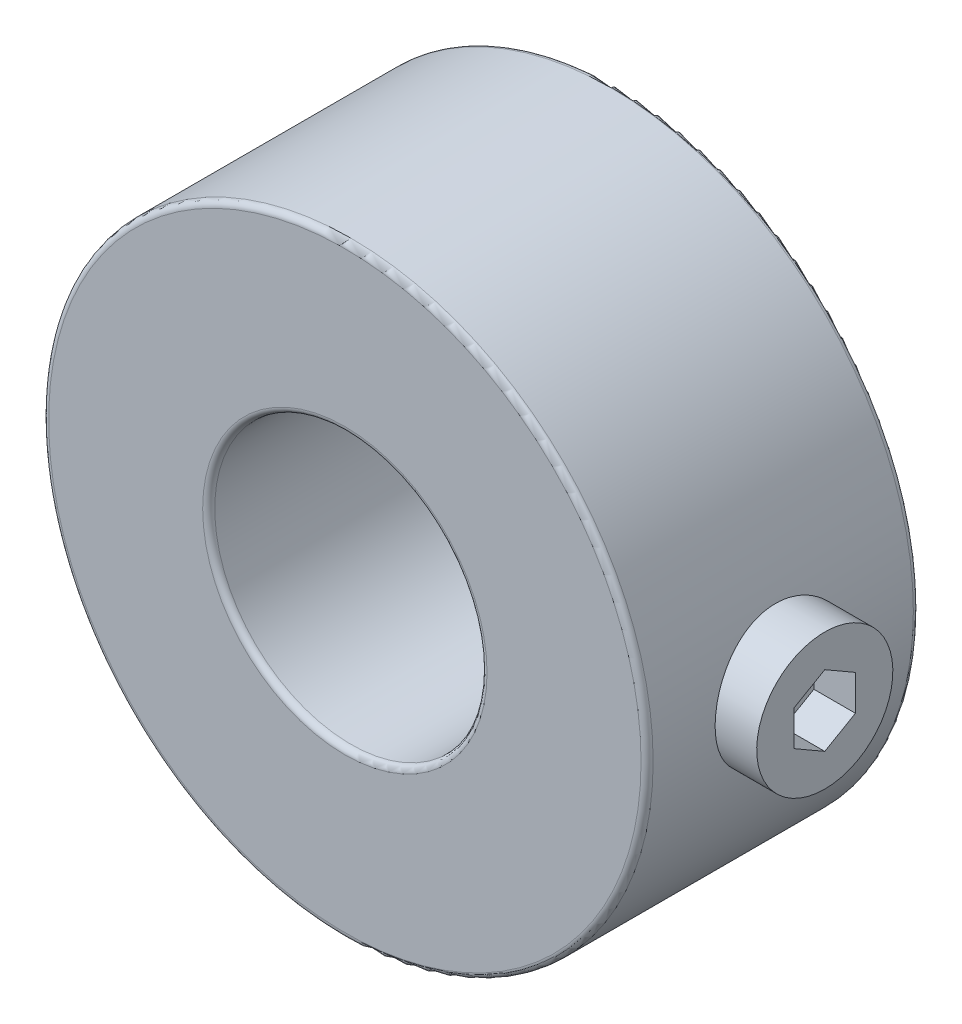
ISO-10303-21;
HEADER;
FILE_DESCRIPTION(('STEP AP214'),'2;1');
FILE_NAME('part.step','',(''),(''),'','','');
FILE_SCHEMA(('AUTOMOTIVE_DESIGN { 1 0 10303 214 1 1 1 1 }'));
ENDSEC;
DATA;
#1=APPLICATION_CONTEXT('core data for automotive mechanical design processes');
#2=APPLICATION_PROTOCOL_DEFINITION('international standard','automotive_design',2000,#1);
#3=PRODUCT_CONTEXT('',#1,'mechanical');
#4=PRODUCT('Part','Part','',(#3));
#5=PRODUCT_RELATED_PRODUCT_CATEGORY('part','',(#4));
#6=PRODUCT_DEFINITION_FORMATION('','',#4);
#7=PRODUCT_DEFINITION_CONTEXT('part definition',#1,'design');
#8=PRODUCT_DEFINITION('design','',#6,#7);
#9=PRODUCT_DEFINITION_SHAPE('','',#8);
#10=(LENGTH_UNIT() NAMED_UNIT(*) SI_UNIT(.MILLI.,.METRE.));
#11=(NAMED_UNIT(*) PLANE_ANGLE_UNIT() SI_UNIT($,.RADIAN.));
#12=(NAMED_UNIT(*) SI_UNIT($,.STERADIAN.) SOLID_ANGLE_UNIT());
#13=UNCERTAINTY_MEASURE_WITH_UNIT(LENGTH_MEASURE(1.E-05),#10,'distance_accuracy_value','');
#14=(GEOMETRIC_REPRESENTATION_CONTEXT(3) GLOBAL_UNCERTAINTY_ASSIGNED_CONTEXT((#13)) GLOBAL_UNIT_ASSIGNED_CONTEXT((#10,
#11,#12)) REPRESENTATION_CONTEXT('',''));
#15=CARTESIAN_POINT('',(0.,0.,0.));
#16=DIRECTION('',(0.,0.,1.));
#17=DIRECTION('',(1.,0.,0.));
#18=AXIS2_PLACEMENT_3D('',#15,#16,#17);
#19=CARTESIAN_POINT('',(6.525,0.,5.));
#20=DIRECTION('',(1.,0.,0.));
#21=DIRECTION('',(0.,1.,0.));
#22=AXIS2_PLACEMENT_3D('',#19,#20,#21);
#23=PLANE('',#22);
#24=CARTESIAN_POINT('',(6.525,0.,5.));
#25=DIRECTION('',(-1.,0.,0.));
#26=DIRECTION('',(0.,-1.,0.));
#27=AXIS2_PLACEMENT_3D('',#24,#25,#26);
#28=CIRCLE('',#27,2.5);
#29=CARTESIAN_POINT('',(6.525,-2.5,5.));
#30=VERTEX_POINT('',#29);
#31=EDGE_CURVE('E12',#30,#30,#28,.T.);
#32=ORIENTED_EDGE('',*,*,#31,.T.);
#33=EDGE_LOOP('',(#32));
#34=FACE_BOUND('',#33,.T.);
#35=ADVANCED_FACE('F44',(#34),#23,.F.);
#36=CARTESIAN_POINT('',(6.525,0.,5.));
#37=DIRECTION('',(-1.,0.,0.));
#38=DIRECTION('',(0.,-1.,0.));
#39=AXIS2_PLACEMENT_3D('',#36,#37,#38);
#40=CYLINDRICAL_SURFACE('',#39,2.5);
#41=ORIENTED_EDGE('',*,*,#31,.F.);
#42=EDGE_LOOP('',(#41));
#43=FACE_BOUND('',#42,.T.);
#44=CARTESIAN_POINT('',(12.625,0.,5.));
#45=DIRECTION('',(-1.,0.,0.));
#46=DIRECTION('',(0.,-1.,0.));
#47=AXIS2_PLACEMENT_3D('',#44,#45,#46);
#48=CIRCLE('',#47,2.5);
#49=CARTESIAN_POINT('',(12.625,-2.5,5.));
#50=VERTEX_POINT('',#49);
#51=EDGE_CURVE('E51',#50,#50,#48,.T.);
#52=ORIENTED_EDGE('',*,*,#51,.T.);
#53=EDGE_LOOP('',(#52));
#54=FACE_BOUND('',#53,.T.);
#55=ADVANCED_FACE('F154',(#43,#54),#40,.T.);
#56=CARTESIAN_POINT('',(12.625,0.,5.));
#57=DIRECTION('',(-1.,0.,0.));
#58=DIRECTION('',(0.,-1.,0.));
#59=AXIS2_PLACEMENT_3D('',#56,#57,#58);
#60=PLANE('',#59);
#61=DIRECTION('',(0.,-0.5,0.866025403784439));
#62=VECTOR('',#61,1.);
#63=CARTESIAN_POINT('',(12.625,1.29903810567666,5.));
#64=LINE('',#63,#62);
#65=CARTESIAN_POINT('',(12.625,1.29903810567666,5.));
#66=VERTEX_POINT('',#65);
#67=CARTESIAN_POINT('',(12.625,0.649519052838334,6.125));
#68=VERTEX_POINT('',#67);
#69=EDGE_CURVE('E112',#66,#68,#64,.T.);
#70=ORIENTED_EDGE('',*,*,#69,.F.);
#71=DIRECTION('',(0.,0.5,0.866025403784439));
#72=VECTOR('',#71,1.);
#73=CARTESIAN_POINT('',(12.625,0.649519052838332,3.875));
#74=LINE('',#73,#72);
#75=CARTESIAN_POINT('',(12.625,0.649519052838332,3.875));
#76=VERTEX_POINT('',#75);
#77=EDGE_CURVE('E58',#76,#66,#74,.T.);
#78=ORIENTED_EDGE('',*,*,#77,.F.);
#79=DIRECTION('',(0.,1.,0.));
#80=VECTOR('',#79,1.);
#81=CARTESIAN_POINT('',(12.625,-0.649519052838325,3.875));
#82=LINE('',#81,#80);
#83=CARTESIAN_POINT('',(12.625,-0.649519052838325,3.875));
#84=VERTEX_POINT('',#83);
#85=EDGE_CURVE('E128',#84,#76,#82,.T.);
#86=ORIENTED_EDGE('',*,*,#85,.F.);
#87=DIRECTION('',(0.,0.5,-0.866025403784439));
#88=VECTOR('',#87,1.);
#89=CARTESIAN_POINT('',(12.625,-1.29903810567665,5.));
#90=LINE('',#89,#88);
#91=CARTESIAN_POINT('',(12.625,-1.29903810567665,5.));
#92=VERTEX_POINT('',#91);
#93=EDGE_CURVE('E122',#92,#84,#90,.T.);
#94=ORIENTED_EDGE('',*,*,#93,.F.);
#95=DIRECTION('',(0.,-0.5,-0.866025403784438));
#96=VECTOR('',#95,1.);
#97=CARTESIAN_POINT('',(12.625,-0.649519052838323,6.125));
#98=LINE('',#97,#96);
#99=CARTESIAN_POINT('',(12.625,-0.649519052838323,6.125));
#100=VERTEX_POINT('',#99);
#101=EDGE_CURVE('E120',#100,#92,#98,.T.);
#102=ORIENTED_EDGE('',*,*,#101,.F.);
#103=DIRECTION('',(0.,-1.,0.));
#104=VECTOR('',#103,1.);
#105=CARTESIAN_POINT('',(12.625,0.649519052838334,6.125));
#106=LINE('',#105,#104);
#107=EDGE_CURVE('E101',#68,#100,#106,.T.);
#108=ORIENTED_EDGE('',*,*,#107,.F.);
#109=EDGE_LOOP('',(#70,#78,#86,#94,#102,#108));
#110=FACE_BOUND('',#109,.T.);
#111=ORIENTED_EDGE('',*,*,#51,.F.);
#112=EDGE_LOOP('',(#111));
#113=FACE_BOUND('',#112,.T.);
#114=ADVANCED_FACE('F116',(#110,#113),#60,.F.);
#115=CARTESIAN_POINT('',(11.1,0.649519052838332,3.875));
#116=DIRECTION('',(0.,0.866025403784439,-0.5));
#117=DIRECTION('',(0.,0.5,0.866025403784439));
#118=AXIS2_PLACEMENT_3D('',#115,#116,#117);
#119=PLANE('',#118);
#120=ORIENTED_EDGE('',*,*,#77,.T.);
#121=DIRECTION('',(1.,0.,0.));
#122=VECTOR('',#121,1.);
#123=CARTESIAN_POINT('',(11.1,1.29903810567666,5.));
#124=LINE('',#123,#122);
#125=CARTESIAN_POINT('',(11.1,1.29903810567666,5.));
#126=VERTEX_POINT('',#125);
#127=EDGE_CURVE('E109',#126,#66,#124,.T.);
#128=ORIENTED_EDGE('',*,*,#127,.F.);
#129=DIRECTION('',(0.,0.5,0.866025403784439));
#130=VECTOR('',#129,1.);
#131=CARTESIAN_POINT('',(11.1,0.649519052838332,3.875));
#132=LINE('',#131,#130);
#133=CARTESIAN_POINT('',(11.1,0.649519052838332,3.875));
#134=VERTEX_POINT('',#133);
#135=EDGE_CURVE('E130',#134,#126,#132,.T.);
#136=ORIENTED_EDGE('',*,*,#135,.F.);
#137=DIRECTION('',(1.,0.,0.));
#138=VECTOR('',#137,1.);
#139=CARTESIAN_POINT('',(11.1,0.649519052838332,3.875));
#140=LINE('',#139,#138);
#141=EDGE_CURVE('E65',#134,#76,#140,.T.);
#142=ORIENTED_EDGE('',*,*,#141,.T.);
#143=EDGE_LOOP('',(#120,#128,#136,#142));
#144=FACE_BOUND('',#143,.T.);
#145=ADVANCED_FACE('F156',(#144),#119,.F.);
#146=CARTESIAN_POINT('',(11.1,-0.649519052838325,3.875));
#147=DIRECTION('',(0.,0.,-1.));
#148=DIRECTION('',(-1.,0.,0.));
#149=AXIS2_PLACEMENT_3D('',#146,#147,#148);
#150=PLANE('',#149);
#151=ORIENTED_EDGE('',*,*,#85,.T.);
#152=ORIENTED_EDGE('',*,*,#141,.F.);
#153=DIRECTION('',(0.,1.,0.));
#154=VECTOR('',#153,1.);
#155=CARTESIAN_POINT('',(11.1,-0.649519052838325,3.875));
#156=LINE('',#155,#154);
#157=CARTESIAN_POINT('',(11.1,-0.649519052838325,3.875));
#158=VERTEX_POINT('',#157);
#159=EDGE_CURVE('E142',#158,#134,#156,.T.);
#160=ORIENTED_EDGE('',*,*,#159,.F.);
#161=DIRECTION('',(1.,0.,0.));
#162=VECTOR('',#161,1.);
#163=CARTESIAN_POINT('',(11.1,-0.649519052838325,3.875));
#164=LINE('',#163,#162);
#165=EDGE_CURVE('E146',#158,#84,#164,.T.);
#166=ORIENTED_EDGE('',*,*,#165,.T.);
#167=EDGE_LOOP('',(#151,#152,#160,#166));
#168=FACE_BOUND('',#167,.T.);
#169=ADVANCED_FACE('F162',(#168),#150,.F.);
#170=CARTESIAN_POINT('',(11.1,-1.29903810567665,5.));
#171=DIRECTION('',(0.,-0.866025403784439,-0.5));
#172=DIRECTION('',(0.,0.5,-0.866025403784439));
#173=AXIS2_PLACEMENT_3D('',#170,#171,#172);
#174=PLANE('',#173);
#175=ORIENTED_EDGE('',*,*,#93,.T.);
#176=ORIENTED_EDGE('',*,*,#165,.F.);
#177=DIRECTION('',(0.,0.5,-0.866025403784439));
#178=VECTOR('',#177,1.);
#179=CARTESIAN_POINT('',(11.1,-1.29903810567665,5.));
#180=LINE('',#179,#178);
#181=CARTESIAN_POINT('',(11.1,-1.29903810567665,5.));
#182=VERTEX_POINT('',#181);
#183=EDGE_CURVE('E139',#182,#158,#180,.T.);
#184=ORIENTED_EDGE('',*,*,#183,.F.);
#185=DIRECTION('',(1.,0.,0.));
#186=VECTOR('',#185,1.);
#187=CARTESIAN_POINT('',(11.1,-1.29903810567665,5.));
#188=LINE('',#187,#186);
#189=EDGE_CURVE('E148',#182,#92,#188,.T.);
#190=ORIENTED_EDGE('',*,*,#189,.T.);
#191=EDGE_LOOP('',(#175,#176,#184,#190));
#192=FACE_BOUND('',#191,.T.);
#193=ADVANCED_FACE('F193',(#192),#174,.F.);
#194=CARTESIAN_POINT('',(11.1,-0.649519052838323,6.125));
#195=DIRECTION('',(0.,-0.866025403784439,0.5));
#196=DIRECTION('',(0.,-0.5,-0.866025403784439));
#197=AXIS2_PLACEMENT_3D('',#194,#195,#196);
#198=PLANE('',#197);
#199=ORIENTED_EDGE('',*,*,#101,.T.);
#200=ORIENTED_EDGE('',*,*,#189,.F.);
#201=DIRECTION('',(0.,-0.5,-0.866025403784438));
#202=VECTOR('',#201,1.);
#203=CARTESIAN_POINT('',(11.1,-0.649519052838323,6.125));
#204=LINE('',#203,#202);
#205=CARTESIAN_POINT('',(11.1,-0.649519052838323,6.125));
#206=VERTEX_POINT('',#205);
#207=EDGE_CURVE('E136',#206,#182,#204,.T.);
#208=ORIENTED_EDGE('',*,*,#207,.F.);
#209=DIRECTION('',(1.,0.,0.));
#210=VECTOR('',#209,1.);
#211=CARTESIAN_POINT('',(11.1,-0.649519052838323,6.125));
#212=LINE('',#211,#210);
#213=EDGE_CURVE('E108',#206,#100,#212,.T.);
#214=ORIENTED_EDGE('',*,*,#213,.T.);
#215=EDGE_LOOP('',(#199,#200,#208,#214));
#216=FACE_BOUND('',#215,.T.);
#217=ADVANCED_FACE('F202',(#216),#198,.F.);
#218=CARTESIAN_POINT('',(11.1,0.649519052838334,6.125));
#219=DIRECTION('',(0.,0.,1.));
#220=DIRECTION('',(1.,0.,0.));
#221=AXIS2_PLACEMENT_3D('',#218,#219,#220);
#222=PLANE('',#221);
#223=ORIENTED_EDGE('',*,*,#107,.T.);
#224=ORIENTED_EDGE('',*,*,#213,.F.);
#225=DIRECTION('',(0.,-1.,0.));
#226=VECTOR('',#225,1.);
#227=CARTESIAN_POINT('',(11.1,0.649519052838334,6.125));
#228=LINE('',#227,#226);
#229=CARTESIAN_POINT('',(11.1,0.649519052838334,6.125));
#230=VERTEX_POINT('',#229);
#231=EDGE_CURVE('E104',#230,#206,#228,.T.);
#232=ORIENTED_EDGE('',*,*,#231,.F.);
#233=DIRECTION('',(1.,0.,0.));
#234=VECTOR('',#233,1.);
#235=CARTESIAN_POINT('',(11.1,0.649519052838334,6.125));
#236=LINE('',#235,#234);
#237=EDGE_CURVE('E97',#230,#68,#236,.T.);
#238=ORIENTED_EDGE('',*,*,#237,.T.);
#239=EDGE_LOOP('',(#223,#224,#232,#238));
#240=FACE_BOUND('',#239,.T.);
#241=ADVANCED_FACE('F99',(#240),#222,.F.);
#242=CARTESIAN_POINT('',(11.1,1.29903810567666,5.));
#243=DIRECTION('',(0.,0.866025403784439,0.5));
#244=DIRECTION('',(0.,-0.5,0.866025403784439));
#245=AXIS2_PLACEMENT_3D('',#242,#243,#244);
#246=PLANE('',#245);
#247=ORIENTED_EDGE('',*,*,#69,.T.);
#248=ORIENTED_EDGE('',*,*,#237,.F.);
#249=DIRECTION('',(0.,-0.5,0.866025403784439));
#250=VECTOR('',#249,1.);
#251=CARTESIAN_POINT('',(11.1,1.29903810567666,5.));
#252=LINE('',#251,#250);
#253=EDGE_CURVE('E133',#126,#230,#252,.T.);
#254=ORIENTED_EDGE('',*,*,#253,.F.);
#255=ORIENTED_EDGE('',*,*,#127,.T.);
#256=EDGE_LOOP('',(#247,#248,#254,#255));
#257=FACE_BOUND('',#256,.T.);
#258=ADVANCED_FACE('F113',(#257),#246,.F.);
#259=CARTESIAN_POINT('',(11.1,1.94855715851499,6.125));
#260=DIRECTION('',(1.,0.,0.));
#261=DIRECTION('',(0.,0.,-1.));
#262=AXIS2_PLACEMENT_3D('',#259,#260,#261);
#263=PLANE('',#262);
#264=ORIENTED_EDGE('',*,*,#135,.T.);
#265=ORIENTED_EDGE('',*,*,#253,.T.);
#266=ORIENTED_EDGE('',*,*,#231,.T.);
#267=ORIENTED_EDGE('',*,*,#207,.T.);
#268=ORIENTED_EDGE('',*,*,#183,.T.);
#269=ORIENTED_EDGE('',*,*,#159,.T.);
#270=EDGE_LOOP('',(#264,#265,#266,#267,#268,#269));
#271=FACE_BOUND('',#270,.T.);
#272=ADVANCED_FACE('F229',(#271),#263,.T.);
#273=CLOSED_SHELL('',(#35,#55,#114,#145,#169,#193,#217,#241,#258,#272));
#274=MANIFOLD_SOLID_BREP('B2',#273);
#275=CARTESIAN_POINT('',(0.,0.,10.));
#276=DIRECTION('',(0.,0.,1.));
#277=DIRECTION('',(1.,0.,0.));
#278=AXIS2_PLACEMENT_3D('',#275,#276,#277);
#279=PLANE('',#278);
#280=CARTESIAN_POINT('',(0.,0.,10.));
#281=DIRECTION('',(0.,0.,1.));
#282=DIRECTION('',(1.,0.,0.));
#283=AXIS2_PLACEMENT_3D('',#280,#281,#282);
#284=CIRCLE('',#283,5.222);
#285=CARTESIAN_POINT('',(5.222,0.,10.));
#286=VERTEX_POINT('',#285);
#287=EDGE_CURVE('E261',#286,#286,#284,.F.);
#288=ORIENTED_EDGE('',*,*,#287,.T.);
#289=EDGE_LOOP('',(#288));
#290=FACE_BOUND('',#289,.T.);
#291=CARTESIAN_POINT('',(0.,0.,10.));
#292=DIRECTION('',(0.,0.,1.));
#293=DIRECTION('',(1.,0.,0.));
#294=AXIS2_PLACEMENT_3D('',#291,#292,#293);
#295=CIRCLE('',#294,10.878);
#296=CARTESIAN_POINT('',(10.878,0.,10.));
#297=VERTEX_POINT('',#296);
#298=EDGE_CURVE('E265',#297,#297,#295,.T.);
#299=ORIENTED_EDGE('',*,*,#298,.T.);
#300=EDGE_LOOP('',(#299));
#301=FACE_BOUND('',#300,.T.);
#302=ADVANCED_FACE('F249',(#290,#301),#279,.T.);
#303=CARTESIAN_POINT('',(0.,0.,0.));
#304=DIRECTION('',(0.,0.,1.));
#305=DIRECTION('',(1.,0.,0.));
#306=AXIS2_PLACEMENT_3D('',#303,#304,#305);
#307=PLANE('',#306);
#308=CARTESIAN_POINT('',(0.,0.,0.));
#309=DIRECTION('',(0.,0.,1.));
#310=DIRECTION('',(1.,0.,0.));
#311=AXIS2_PLACEMENT_3D('',#308,#309,#310);
#312=CIRCLE('',#311,5.222);
#313=CARTESIAN_POINT('',(5.222,0.,0.));
#314=VERTEX_POINT('',#313);
#315=EDGE_CURVE('E276',#314,#314,#312,.T.);
#316=ORIENTED_EDGE('',*,*,#315,.T.);
#317=EDGE_LOOP('',(#316));
#318=FACE_BOUND('',#317,.T.);
#319=CARTESIAN_POINT('',(0.,0.,0.));
#320=DIRECTION('',(0.,0.,1.));
#321=DIRECTION('',(1.,0.,0.));
#322=AXIS2_PLACEMENT_3D('',#319,#320,#321);
#323=CIRCLE('',#322,10.878);
#324=CARTESIAN_POINT('',(10.878,0.,0.));
#325=VERTEX_POINT('',#324);
#326=EDGE_CURVE('E279',#325,#325,#323,.F.);
#327=ORIENTED_EDGE('',*,*,#326,.T.);
#328=EDGE_LOOP('',(#327));
#329=FACE_BOUND('',#328,.T.);
#330=ADVANCED_FACE('F320',(#318,#329),#307,.F.);
#331=CARTESIAN_POINT('',(0.,0.,10.));
#332=DIRECTION('',(0.,0.,-1.));
#333=DIRECTION('',(-1.,0.,0.));
#334=AXIS2_PLACEMENT_3D('',#331,#332,#333);
#335=CYLINDRICAL_SURFACE('',#334,11.1);
#336=CARTESIAN_POINT('',(0.,0.,0.222));
#337=DIRECTION('',(0.,0.,1.));
#338=DIRECTION('',(1.,0.,0.));
#339=AXIS2_PLACEMENT_3D('',#336,#337,#338);
#340=CIRCLE('',#339,11.1);
#341=CARTESIAN_POINT('',(11.1,0.,0.222));
#342=VERTEX_POINT('',#341);
#343=EDGE_CURVE('E43',#342,#342,#340,.T.);
#344=ORIENTED_EDGE('',*,*,#343,.T.);
#345=EDGE_LOOP('',(#344));
#346=FACE_BOUND('',#345,.T.);
#347=CARTESIAN_POINT('',(0.,0.,9.778));
#348=DIRECTION('',(0.,0.,1.));
#349=DIRECTION('',(1.,0.,0.));
#350=AXIS2_PLACEMENT_3D('',#347,#348,#349);
#351=CIRCLE('',#350,11.1);
#352=CARTESIAN_POINT('',(11.1,0.,9.778));
#353=VERTEX_POINT('',#352);
#354=EDGE_CURVE('E257',#353,#353,#351,.F.);
#355=ORIENTED_EDGE('',*,*,#354,.T.);
#356=EDGE_LOOP('',(#355));
#357=FACE_BOUND('',#356,.T.);
#358=CARTESIAN_POINT('',(11.1,0.,2.5));
#359=CARTESIAN_POINT('',(11.0999974642221,-0.138551857074744,2.50000458252204));
#360=CARTESIAN_POINT('',(11.0973796013773,-0.277158206862901,2.51155683551995));
#361=CARTESIAN_POINT('',(11.0871894296878,-0.550426811107474,2.55740847913059));
#362=CARTESIAN_POINT('',(11.0796137255504,-0.685086296545099,2.59172345862623));
#363=CARTESIAN_POINT('',(11.0603504630089,-0.946472997816261,2.68196568668179));
#364=CARTESIAN_POINT('',(11.0486673298046,-1.07320857819181,2.73786968234976));
#365=CARTESIAN_POINT('',(11.0224468264703,-1.31549816414032,2.86962760291036));
#366=CARTESIAN_POINT('',(11.0079094957467,-1.43105232405665,2.94548125237305));
#367=CARTESIAN_POINT('',(10.9772947578809,-1.6496614244481,3.11634567560539));
#368=CARTESIAN_POINT('',(10.9611973005938,-1.75249968370212,3.21163010765147));
#369=CARTESIAN_POINT('',(10.9294162332532,-1.94087805534867,3.41806413809722));
#370=CARTESIAN_POINT('',(10.9137326620223,-2.02641654999773,3.52921521856981));
#371=CARTESIAN_POINT('',(10.8843566148955,-2.17873567060238,3.76584533402192));
#372=CARTESIAN_POINT('',(10.8706897870561,-2.24528331301864,3.89147781022681));
#373=CARTESIAN_POINT('',(10.8471833962762,-2.35623648142787,4.15250184657415));
#374=CARTESIAN_POINT('',(10.8373433459574,-2.40064482728462,4.28789216135327));
#375=CARTESIAN_POINT('',(10.8228092379658,-2.46533811354041,4.56223154044035));
#376=CARTESIAN_POINT('',(10.8180331827312,-2.48600790795349,4.70108541186211));
#377=CARTESIAN_POINT('',(10.8139217310898,-2.50383444303533,4.98036582636141));
#378=CARTESIAN_POINT('',(10.8145856240234,-2.50099425498238,5.12079216162316));
#379=CARTESIAN_POINT('',(10.8212049242801,-2.47219062916531,5.39635313100996));
#380=CARTESIAN_POINT('',(10.8270575087353,-2.44667649145171,5.53153757567756));
#381=CARTESIAN_POINT('',(10.8432319319857,-2.37396201299992,5.7956566112483));
#382=CARTESIAN_POINT('',(10.8535540350324,-2.32676039002225,5.92459083211813));
#383=CARTESIAN_POINT('',(10.8776043945316,-2.21160421044483,6.17380095911974));
#384=CARTESIAN_POINT('',(10.8913605075971,-2.14347882489928,6.29399512736049));
#385=CARTESIAN_POINT('',(10.9207121111966,-1.98852892866706,6.52141104690833));
#386=CARTESIAN_POINT('',(10.9363078665708,-1.90170172412433,6.6286309258883));
#387=CARTESIAN_POINT('',(10.9680210724837,-1.70944458164534,6.82963918944382));
#388=CARTESIAN_POINT('',(10.9841422775389,-1.60363313763295,6.9230624646406));
#389=CARTESIAN_POINT('',(11.0147643284876,-1.37765989443892,7.09089964989496));
#390=CARTESIAN_POINT('',(11.0292651414882,-1.25749780405081,7.16531317410628));
#391=CARTESIAN_POINT('',(11.0550641831262,-1.00577378254967,7.29311724664232));
#392=CARTESIAN_POINT('',(11.0663547627491,-0.874185583449588,7.34645769995545));
#393=CARTESIAN_POINT('',(11.084404659146,-0.60360230521959,7.43016694076612));
#394=CARTESIAN_POINT('',(11.0911646755061,-0.464608373224197,7.46053927497394));
#395=CARTESIAN_POINT('',(11.0992914132653,-0.186288910685377,7.49691385282653));
#396=CARTESIAN_POINT('',(11.100768423264,-0.0470316528022032,7.50341452196265));
#397=CARTESIAN_POINT('',(11.0984727866936,0.230579201313461,7.49321537205713));
#398=CARTESIAN_POINT('',(11.0947005188503,0.368932862015286,7.47651722676734));
#399=CARTESIAN_POINT('',(11.08240000466,0.63914180371647,7.42080734834975));
#400=CARTESIAN_POINT('',(11.073927951256,0.771054197797043,7.38205911815381));
#401=CARTESIAN_POINT('',(11.0531770911689,1.02650593952539,7.28364313911977));
#402=CARTESIAN_POINT('',(11.0408979470473,1.15004454378544,7.22397353587042));
#403=CARTESIAN_POINT('',(11.0136242430139,1.38728763725982,7.08438457606875));
#404=CARTESIAN_POINT('',(10.99859173973,1.50081696309727,7.00417509595013));
#405=CARTESIAN_POINT('',(10.967552435554,1.71298298098244,6.82616299889566));
#406=CARTESIAN_POINT('',(10.9515455001529,1.81161761041852,6.72835794943432));
#407=CARTESIAN_POINT('',(10.9199772121304,1.99318175390826,6.51563789360256));
#408=CARTESIAN_POINT('',(10.9044307646294,2.07576514640586,6.40042482694668));
#409=CARTESIAN_POINT('',(10.875900782905,2.22041428331204,6.15747319837916));
#410=CARTESIAN_POINT('',(10.8629171358811,2.28248093083587,6.0297351881171));
#411=CARTESIAN_POINT('',(10.8411113599425,2.38390385079708,5.76605260237747));
#412=CARTESIAN_POINT('',(10.8322654206729,2.42339036033918,5.63016018868187));
#413=CARTESIAN_POINT('',(10.8196969508361,2.47890762436238,5.3534426131441));
#414=CARTESIAN_POINT('',(10.8159735436727,2.49494239206539,5.21261829950669));
#415=CARTESIAN_POINT('',(10.8141293004491,2.50292226702926,4.93353017859107));
#416=CARTESIAN_POINT('',(10.8158806461877,2.49541694727612,4.79528264980101));
#417=CARTESIAN_POINT('',(10.8244982289712,2.45776407060649,4.52207703193617));
#418=CARTESIAN_POINT('',(10.8313643980455,2.42761681457763,4.38711889917336));
#419=CARTESIAN_POINT('',(10.8493738476025,2.34580850521106,4.1247913954579));
#420=CARTESIAN_POINT('',(10.8605003022432,2.29423201848577,3.99739441967403));
#421=CARTESIAN_POINT('',(10.8857823024346,2.1711003200851,3.75298181015713));
#422=CARTESIAN_POINT('',(10.8999381851898,2.09954288406719,3.63596733414911));
#423=CARTESIAN_POINT('',(10.9300624304302,1.93667754864501,3.41294250519504));
#424=CARTESIAN_POINT('',(10.9460630815732,1.8449799752307,3.30722102172106));
#425=CARTESIAN_POINT('',(10.977862109324,1.64522119585639,3.11248628264726));
#426=CARTESIAN_POINT('',(10.993660438137,1.53715619800199,3.02347690952635));
#427=CARTESIAN_POINT('',(11.023536343445,1.30591398476952,2.86350038801611));
#428=CARTESIAN_POINT('',(11.0375868667071,1.18254712729128,2.79280200647112));
#429=CARTESIAN_POINT('',(11.062110270011,0.925387068502279,2.67325782293835));
#430=CARTESIAN_POINT('',(11.0725860645005,0.791602470526673,2.62439420913032));
#431=CARTESIAN_POINT('',(11.0869726989374,0.548126399309385,2.55833261296967));
#432=CARTESIAN_POINT('',(11.0918270449772,0.439724025784467,2.53650067110134));
#433=CARTESIAN_POINT('',(11.0983416272087,0.220892580342668,2.50733289708414));
#434=CARTESIAN_POINT('',(11.1000020217065,0.110463609146642,2.49999634648041));
#435=CARTESIAN_POINT('',(11.1,0.,2.5));
#436=B_SPLINE_CURVE_WITH_KNOTS('',3,(#358,#359,#360,#361,#362,#363,#364,#365,#366,#367,#368,
#369,#370,#371,#372,#373,#374,#375,#376,#377,#378,#379,#380,#381,#382,#383,#384,#385,#386,#387,
#388,#389,#390,#391,#392,#393,#394,#395,#396,#397,#398,#399,#400,#401,#402,#403,#404,#405,#406,
#407,#408,#409,#410,#411,#412,#413,#414,#415,#416,#417,#418,#419,#420,#421,#422,#423,#424,#425,
#426,#427,#428,#429,#430,#431,#432,#433,#434,#435),.UNSPECIFIED.,.T.,.F.,(4,2,2,2,2,2,2,2,2,2,2,
2,2,2,2,2,2,2,2,2,2,2,2,2,2,2,2,2,2,2,2,2,2,2,2,2,2,2,4),(0.,0.415251140693582,
0.830786957026644,1.24587645467726,1.66096022179848,2.08235314429312,2.5037854540731,
2.93018519439622,3.35653061065531,3.77586187341567,4.19513835677871,4.6062873717081,
5.01746069832432,5.43208447887151,5.84676802283631,6.27097722060829,6.6951950279899,
7.12041530594412,7.54556990846131,7.96179538455897,8.37799083231248,8.78931407767742,
9.20067379079056,9.61819950813984,10.0357829913669,10.4615598538457,10.8873179717917,
11.3105949811659,11.7337995480146,12.1471980336085,12.5605910256663,12.9723679025751,
13.3841906380776,13.8048210632037,14.2255490866292,14.6521412717136,15.078384823964,
15.4094696204138,15.7405380064444),.UNSPECIFIED.);
#437=CARTESIAN_POINT('',(11.1,0.,2.5));
#438=VERTEX_POINT('',#437);
#439=EDGE_CURVE('E282',#438,#438,#436,.T.);
#440=ORIENTED_EDGE('',*,*,#439,.T.);
#441=EDGE_LOOP('',(#440));
#442=FACE_BOUND('',#441,.T.);
#443=ADVANCED_FACE('F251',(#346,#357,#442),#335,.T.);
#444=CARTESIAN_POINT('',(0.,0.,10.));
#445=DIRECTION('',(0.,0.,-1.));
#446=DIRECTION('',(-1.,0.,0.));
#447=AXIS2_PLACEMENT_3D('',#444,#445,#446);
#448=CYLINDRICAL_SURFACE('',#447,5.);
#449=CARTESIAN_POINT('',(0.,0.,0.222));
#450=DIRECTION('',(0.,0.,1.));
#451=DIRECTION('',(1.,0.,0.));
#452=AXIS2_PLACEMENT_3D('',#449,#450,#451);
#453=CIRCLE('',#452,5.);
#454=CARTESIAN_POINT('',(5.,0.,0.222));
#455=VERTEX_POINT('',#454);
#456=EDGE_CURVE('E270',#455,#455,#453,.F.);
#457=ORIENTED_EDGE('',*,*,#456,.T.);
#458=EDGE_LOOP('',(#457));
#459=FACE_BOUND('',#458,.T.);
#460=CARTESIAN_POINT('',(0.,0.,9.778));
#461=DIRECTION('',(0.,0.,1.));
#462=DIRECTION('',(1.,0.,0.));
#463=AXIS2_PLACEMENT_3D('',#460,#461,#462);
#464=CIRCLE('',#463,5.);
#465=CARTESIAN_POINT('',(5.,0.,9.778));
#466=VERTEX_POINT('',#465);
#467=EDGE_CURVE('E273',#466,#466,#464,.T.);
#468=ORIENTED_EDGE('',*,*,#467,.T.);
#469=EDGE_LOOP('',(#468));
#470=FACE_BOUND('',#469,.T.);
#471=CARTESIAN_POINT('',(5.,0.,2.5));
#472=CARTESIAN_POINT('',(4.99999177550472,-0.131426682334305,2.50000966905601));
#473=CARTESIAN_POINT('',(4.99476199135277,-0.263015634437213,2.51042556177403));
#474=CARTESIAN_POINT('',(4.9743541856102,-0.522301454622883,2.55163182116205));
#475=CARTESIAN_POINT('',(4.9591572718767,-0.649990448564105,2.58246088092502));
#476=CARTESIAN_POINT('',(4.92040690922477,-0.897333631316203,2.66298462271884));
#477=CARTESIAN_POINT('',(4.89688595907259,-1.01701694536277,2.71260598778273));
#478=CARTESIAN_POINT('',(4.84364443325827,-1.24618160399671,2.8289265262518));
#479=CARTESIAN_POINT('',(4.81392434644421,-1.3556637520377,2.89562435314509));
#480=CARTESIAN_POINT('',(4.74890645050632,-1.56876952630998,3.04879313164263));
#481=CARTESIAN_POINT('',(4.71337997659091,-1.67163802294308,3.13621620022978));
#482=CARTESIAN_POINT('',(4.64149925776731,-1.86194861703333,3.32630369598529));
#483=CARTESIAN_POINT('',(4.60514440566897,-1.94937895911555,3.42897962884011));
#484=CARTESIAN_POINT('',(4.53247377945622,-2.11312999967247,3.65620837444528));
#485=CARTESIAN_POINT('',(4.49637967412567,-2.18806333849064,3.78184024603501));
#486=CARTESIAN_POINT('',(4.43214946943555,-2.31542056761491,4.04591833979544));
#487=CARTESIAN_POINT('',(4.40400769020792,-2.36786053751682,4.18435532176262));
#488=CARTESIAN_POINT('',(4.36144667591402,-2.44533110537653,4.46166276359641));
#489=CARTESIAN_POINT('',(4.34630678958452,-2.47181464267578,4.60001113017958));
#490=CARTESIAN_POINT('',(4.3295472487215,-2.50106748329741,4.87994709443761));
#491=CARTESIAN_POINT('',(4.3279142335843,-2.50386022093906,5.02153135217509));
#492=CARTESIAN_POINT('',(4.33777325642937,-2.48671821792512,5.28571506079088));
#493=CARTESIAN_POINT('',(4.34771909154984,-2.46946139884055,5.40856007805829));
#494=CARTESIAN_POINT('',(4.37690571834675,-2.41734962264384,5.64930477343195));
#495=CARTESIAN_POINT('',(4.39614947079454,-2.38248905974454,5.76720286326311));
#496=CARTESIAN_POINT('',(4.44218691031839,-2.29552445096459,5.99807283141433));
#497=CARTESIAN_POINT('',(4.46914601659993,-2.24303766778987,6.11086599696452));
#498=CARTESIAN_POINT('',(4.52758510703513,-2.12260421917012,6.32658573147497));
#499=CARTESIAN_POINT('',(4.55906711950478,-2.0546506095312,6.42950783900021));
#500=CARTESIAN_POINT('',(4.62782894758213,-1.89516513728193,6.63630313185808));
#501=CARTESIAN_POINT('',(4.66533775591865,-1.80173614592319,6.7386421839404));
#502=CARTESIAN_POINT('',(4.73869058251019,-1.59888894685344,6.92683854647725));
#503=CARTESIAN_POINT('',(4.77453379897003,-1.48946314143571,7.01268798008471));
#504=CARTESIAN_POINT('',(4.84254968207409,-1.25129126457962,7.16921415257432));
#505=CARTESIAN_POINT('',(4.87447460405015,-1.12188397899853,7.23900118111436));
#506=CARTESIAN_POINT('',(4.92894702803109,-0.851165538721985,7.35524257260752));
#507=CARTESIAN_POINT('',(4.95150197358894,-0.709863940663162,7.4017154625379));
#508=CARTESIAN_POINT('',(4.98310834353579,-0.43191622915178,7.4661885092917));
#509=CARTESIAN_POINT('',(4.9931234575324,-0.295853826370906,7.486228089367));
#510=CARTESIAN_POINT('',(5.00182533647794,-0.021948999873288,7.50366182783617));
#511=CARTESIAN_POINT('',(5.00051746803426,0.11589254967511,7.5010667140985));
#512=CARTESIAN_POINT('',(4.98727980633468,0.378082429964656,7.4744832789533));
#513=CARTESIAN_POINT('',(4.97618114219992,0.502648520123706,7.4521686681756));
#514=CARTESIAN_POINT('',(4.94555428287529,0.746017230755972,7.38940482026162));
#515=CARTESIAN_POINT('',(4.92602515837625,0.864819214231883,7.34895358386411));
#516=CARTESIAN_POINT('',(4.87960628532329,1.09722152111965,7.25000383391964));
#517=CARTESIAN_POINT('',(4.85252204417873,1.21057599249831,7.19102237471768));
#518=CARTESIAN_POINT('',(4.7935993579975,1.42615340426439,7.05723116087518));
#519=CARTESIAN_POINT('',(4.76175888940534,1.52837157450203,6.98241466348012));
#520=CARTESIAN_POINT('',(4.69270553315087,1.72941922315487,6.81059893670911));
#521=CARTESIAN_POINT('',(4.65527212009488,1.82693019428496,6.7121428290248));
#522=CARTESIAN_POINT('',(4.58155978921587,2.0046408025722,6.50018712195056));
#523=CARTESIAN_POINT('',(4.54528168472407,2.08482846428685,6.38667720293013));
#524=CARTESIAN_POINT('',(4.4762798054528,2.22926978618995,6.14089086451535));
#525=CARTESIAN_POINT('',(4.44381323981254,2.29256373922243,6.00797183470886));
#526=CARTESIAN_POINT('',(4.38935180726746,2.39520706511459,5.73122483111745));
#527=CARTESIAN_POINT('',(4.36734345549014,2.43458729077055,5.58741118400001));
#528=CARTESIAN_POINT('',(4.33903752569351,2.48465421767005,5.30772444263706));
#529=CARTESIAN_POINT('',(4.33143458674097,2.4977324874436,5.17241436588103));
#530=CARTESIAN_POINT('',(4.32913386592579,2.50172288950898,4.90138233261932));
#531=CARTESIAN_POINT('',(4.33443049025111,2.49264462983266,4.76566058012637));
#532=CARTESIAN_POINT('',(4.35594655164663,2.45481530197332,4.51129124438315));
#533=CARTESIAN_POINT('',(4.37107736338133,2.42802074302696,4.39224881827924));
#534=CARTESIAN_POINT('',(4.40927540337603,2.35793843840544,4.16047970780005));
#535=CARTESIAN_POINT('',(4.43234518434965,2.31464538728732,4.04775506843346));
#536=CARTESIAN_POINT('',(4.48571326433413,2.20953919315538,3.82343784728028));
#537=CARTESIAN_POINT('',(4.5163930799845,2.14667719009403,3.71243014826498));
#538=CARTESIAN_POINT('',(4.58088327077455,2.0053780838799,3.50181375675996));
#539=CARTESIAN_POINT('',(4.61469526970767,1.92693287765888,3.40221103737127));
#540=CARTESIAN_POINT('',(4.68655816327011,1.74550556946065,3.20464463625036));
#541=CARTESIAN_POINT('',(4.72462491514981,1.6407002246921,3.10835063582863));
#542=CARTESIAN_POINT('',(4.79694347383545,1.41539785420684,2.93434415057196));
#543=CARTESIAN_POINT('',(4.83119321905446,1.29489242426332,2.85664168139412));
#544=CARTESIAN_POINT('',(4.89245149457782,1.03978808878536,2.7219030205159));
#545=CARTESIAN_POINT('',(4.91940711437488,0.905095560782287,2.66501683221555));
#546=CARTESIAN_POINT('',(4.95177960923351,0.696328709257351,2.5978161412076));
#547=CARTESIAN_POINT('',(4.96122314081874,0.625670413494088,2.57844460199819));
#548=CARTESIAN_POINT('',(4.97717127275101,0.482623997839257,2.5459340516294));
#549=CARTESIAN_POINT('',(4.98367766823159,0.410236963092401,2.53279123332365));
#550=CARTESIAN_POINT('',(4.9923820076613,0.28151868462167,2.51526252771537));
#551=CARTESIAN_POINT('',(4.99523288466454,0.225408499555444,2.50954506346868));
#552=CARTESIAN_POINT('',(4.99904367329659,0.112875528456288,2.50191167053429));
#553=CARTESIAN_POINT('',(5.00000353273198,0.0564527338382176,2.49999584677452));
#554=CARTESIAN_POINT('',(5.,0.,2.5));
#555=B_SPLINE_CURVE_WITH_KNOTS('',3,(#471,#472,#473,#474,#475,#476,#477,#478,#479,#480,#481,
#482,#483,#484,#485,#486,#487,#488,#489,#490,#491,#492,#493,#494,#495,#496,#497,#498,#499,#500,
#501,#502,#503,#504,#505,#506,#507,#508,#509,#510,#511,#512,#513,#514,#515,#516,#517,#518,#519,
#520,#521,#522,#523,#524,#525,#526,#527,#528,#529,#530,#531,#532,#533,#534,#535,#536,#537,#538,
#539,#540,#541,#542,#543,#544,#545,#546,#547,#548,#549,#550,#551,#552,#553,#554),.UNSPECIFIED.,
.T.,.F.,(4,2,2,2,2,2,2,2,2,2,2,2,2,2,2,2,2,2,2,2,2,2,2,2,2,2,2,2,2,2,2,2,2,2,2,2,2,2,2,2,2,4),
(0.,0.394060643550731,0.788870374272994,1.18215538873075,1.57540940145392,1.99245439679522,
2.40981559413509,2.85954316076882,3.30894869745702,3.73145030350574,4.15353393322551,
4.52514281023301,4.89687009814196,5.27725600421218,5.65781303150554,6.08662353334696,
6.51563836496716,6.96457555536102,7.41315542280699,7.82458226178364,8.2358141127869,
8.61517266265305,8.99457304077329,9.38482140069747,9.77523626870848,10.2039902661037,
10.6330397153795,11.0828670540368,11.53211279863,11.9382326875698,12.3441764966106,
12.7114482562151,13.0788382197025,13.4709114195009,13.8631890285845,14.303131068923,
14.7433095845248,15.1866003415819,15.407934939208,15.6291340766843,15.7983933645035,
15.9676573239323),.UNSPECIFIED.);
#556=CARTESIAN_POINT('',(5.,0.,2.5));
#557=VERTEX_POINT('',#556);
#558=EDGE_CURVE('E283',#557,#557,#555,.T.);
#559=ORIENTED_EDGE('',*,*,#558,.F.);
#560=EDGE_LOOP('',(#559));
#561=FACE_BOUND('',#560,.T.);
#562=ADVANCED_FACE('F292',(#459,#470,#561),#448,.F.);
#563=CARTESIAN_POINT('',(-7.07106781186547,0.,5.));
#564=DIRECTION('',(1.,0.,0.));
#565=DIRECTION('',(0.,0.,-1.));
#566=AXIS2_PLACEMENT_3D('',#563,#564,#565);
#567=CYLINDRICAL_SURFACE('',#566,2.5);
#568=ORIENTED_EDGE('',*,*,#558,.T.);
#569=EDGE_LOOP('',(#568));
#570=FACE_BOUND('',#569,.T.);
#571=ORIENTED_EDGE('',*,*,#439,.F.);
#572=EDGE_LOOP('',(#571));
#573=FACE_BOUND('',#572,.T.);
#574=ADVANCED_FACE('F295',(#570,#573),#567,.F.);
#575=CARTESIAN_POINT('',(0.,0.,0.222));
#576=DIRECTION('',(0.,0.,1.));
#577=DIRECTION('',(1.,0.,0.));
#578=AXIS2_PLACEMENT_3D('',#575,#576,#577);
#579=TOROIDAL_SURFACE('',#578,5.222,0.222);
#580=ORIENTED_EDGE('',*,*,#456,.F.);
#581=EDGE_LOOP('',(#580));
#582=FACE_BOUND('',#581,.T.);
#583=ORIENTED_EDGE('',*,*,#315,.F.);
#584=EDGE_LOOP('',(#583));
#585=FACE_BOUND('',#584,.T.);
#586=ADVANCED_FACE('F299',(#582,#585),#579,.T.);
#587=CARTESIAN_POINT('',(0.,0.,9.778));
#588=DIRECTION('',(0.,0.,1.));
#589=DIRECTION('',(1.,0.,0.));
#590=AXIS2_PLACEMENT_3D('',#587,#588,#589);
#591=TOROIDAL_SURFACE('',#590,5.222,0.222);
#592=ORIENTED_EDGE('',*,*,#287,.F.);
#593=EDGE_LOOP('',(#592));
#594=FACE_BOUND('',#593,.T.);
#595=ORIENTED_EDGE('',*,*,#467,.F.);
#596=EDGE_LOOP('',(#595));
#597=FACE_BOUND('',#596,.T.);
#598=ADVANCED_FACE('F304',(#594,#597),#591,.T.);
#599=CARTESIAN_POINT('',(0.,0.,0.222));
#600=DIRECTION('',(0.,0.,1.));
#601=DIRECTION('',(1.,0.,0.));
#602=AXIS2_PLACEMENT_3D('',#599,#600,#601);
#603=TOROIDAL_SURFACE('',#602,10.878,0.222);
#604=ORIENTED_EDGE('',*,*,#326,.F.);
#605=EDGE_LOOP('',(#604));
#606=FACE_BOUND('',#605,.T.);
#607=ORIENTED_EDGE('',*,*,#343,.F.);
#608=EDGE_LOOP('',(#607));
#609=FACE_BOUND('',#608,.T.);
#610=ADVANCED_FACE('F308',(#606,#609),#603,.T.);
#611=CARTESIAN_POINT('',(0.,0.,9.778));
#612=DIRECTION('',(0.,0.,1.));
#613=DIRECTION('',(1.,0.,0.));
#614=AXIS2_PLACEMENT_3D('',#611,#612,#613);
#615=TOROIDAL_SURFACE('',#614,10.878,0.222);
#616=ORIENTED_EDGE('',*,*,#354,.F.);
#617=EDGE_LOOP('',(#616));
#618=FACE_BOUND('',#617,.T.);
#619=ORIENTED_EDGE('',*,*,#298,.F.);
#620=EDGE_LOOP('',(#619));
#621=FACE_BOUND('',#620,.T.);
#622=ADVANCED_FACE('F312',(#618,#621),#615,.T.);
#623=CLOSED_SHELL('',(#302,#330,#443,#562,#574,#586,#598,#610,#622));
#624=MANIFOLD_SOLID_BREP('B6',#623);
#625=ADVANCED_BREP_SHAPE_REPRESENTATION('',(#18,#274,#624),#14);
#626=SHAPE_DEFINITION_REPRESENTATION(#9,#625);
ENDSEC;
END-ISO-10303-21;
